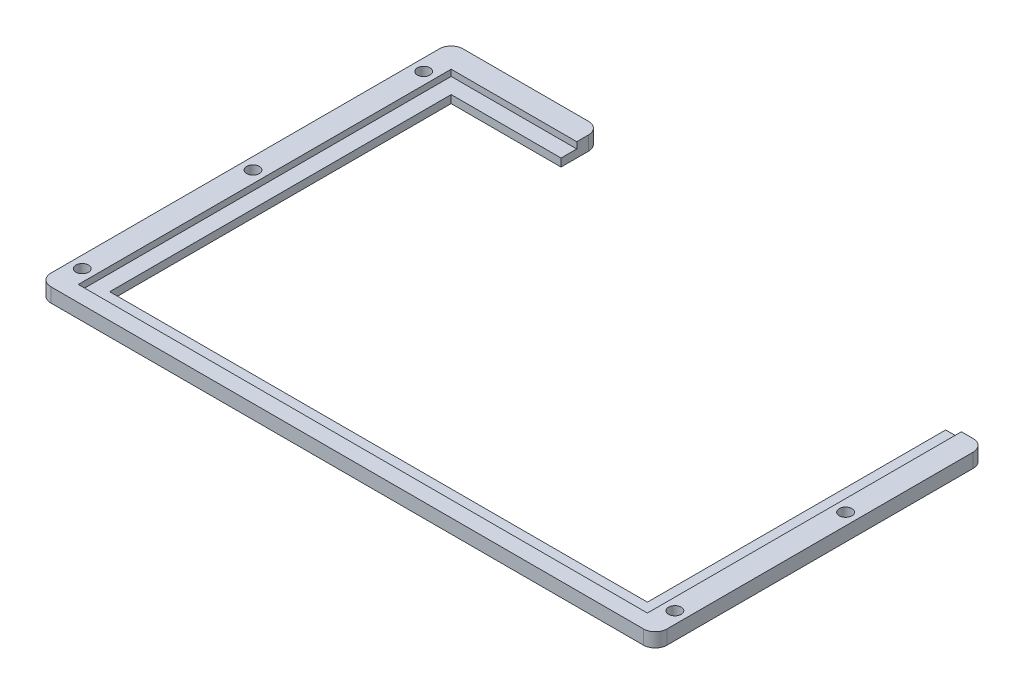
ISO-10303-21;
HEADER;
FILE_DESCRIPTION(('STEP AP214'),'2;1');
FILE_NAME('part.step','',(''),(''),'','','');
FILE_SCHEMA(('AUTOMOTIVE_DESIGN { 1 0 10303 214 1 1 1 1 }'));
ENDSEC;
DATA;
#1=APPLICATION_CONTEXT('core data for automotive mechanical design processes');
#2=APPLICATION_PROTOCOL_DEFINITION('international standard','automotive_design',2000,#1);
#3=PRODUCT_CONTEXT('',#1,'mechanical');
#4=PRODUCT('Part','Part','',(#3));
#5=PRODUCT_RELATED_PRODUCT_CATEGORY('part','',(#4));
#6=PRODUCT_DEFINITION_FORMATION('','',#4);
#7=PRODUCT_DEFINITION_CONTEXT('part definition',#1,'design');
#8=PRODUCT_DEFINITION('design','',#6,#7);
#9=PRODUCT_DEFINITION_SHAPE('','',#8);
#10=(LENGTH_UNIT() NAMED_UNIT(*) SI_UNIT(.MILLI.,.METRE.));
#11=(NAMED_UNIT(*) PLANE_ANGLE_UNIT() SI_UNIT($,.RADIAN.));
#12=(NAMED_UNIT(*) SI_UNIT($,.STERADIAN.) SOLID_ANGLE_UNIT());
#13=UNCERTAINTY_MEASURE_WITH_UNIT(LENGTH_MEASURE(1.E-05),#10,'distance_accuracy_value','');
#14=(GEOMETRIC_REPRESENTATION_CONTEXT(3) GLOBAL_UNCERTAINTY_ASSIGNED_CONTEXT((#13)) GLOBAL_UNIT_ASSIGNED_CONTEXT((#10,
#11,#12)) REPRESENTATION_CONTEXT('',''));
#15=CARTESIAN_POINT('',(0.,0.,0.));
#16=DIRECTION('',(0.,0.,1.));
#17=DIRECTION('',(1.,0.,0.));
#18=AXIS2_PLACEMENT_3D('',#15,#16,#17);
#19=CARTESIAN_POINT('',(119.85625,3.175,-46.83125));
#20=DIRECTION('',(0.,-1.,0.));
#21=DIRECTION('',(0.,0.,-1.));
#22=AXIS2_PLACEMENT_3D('',#19,#20,#21);
#23=PLANE('',#22);
#24=DIRECTION('',(0.,0.,1.));
#25=VECTOR('',#24,1.);
#26=CARTESIAN_POINT('',(115.09375,3.175,75.40625));
#27=LINE('',#26,#25);
#28=CARTESIAN_POINT('',(115.09375,3.175,-51.59375));
#29=VERTEX_POINT('',#28);
#30=CARTESIAN_POINT('',(115.09375,3.175,75.40625));
#31=VERTEX_POINT('',#30);
#32=EDGE_CURVE('E220',#29,#31,#27,.T.);
#33=ORIENTED_EDGE('',*,*,#32,.F.);
#34=DIRECTION('',(-1.,0.,0.));
#35=VECTOR('',#34,1.);
#36=CARTESIAN_POINT('',(108.74375,3.175,-51.59375));
#37=LINE('',#36,#35);
#38=CARTESIAN_POINT('',(108.74375,3.175,-51.59375));
#39=VERTEX_POINT('',#38);
#40=EDGE_CURVE('E214',#29,#39,#37,.T.);
#41=ORIENTED_EDGE('',*,*,#40,.T.);
#42=DIRECTION('',(0.,0.,1.));
#43=VECTOR('',#42,1.);
#44=CARTESIAN_POINT('',(108.74375,3.175,69.05625));
#45=LINE('',#44,#43);
#46=CARTESIAN_POINT('',(108.74375,3.175,69.05625));
#47=VERTEX_POINT('',#46);
#48=EDGE_CURVE('E217',#39,#47,#45,.T.);
#49=ORIENTED_EDGE('',*,*,#48,.T.);
#50=DIRECTION('',(-1.,0.,0.));
#51=VECTOR('',#50,1.);
#52=CARTESIAN_POINT('',(-108.74375,3.175,69.05625));
#53=LINE('',#52,#51);
#54=CARTESIAN_POINT('',(-108.74375,3.175,69.05625));
#55=VERTEX_POINT('',#54);
#56=EDGE_CURVE('E477',#47,#55,#53,.T.);
#57=ORIENTED_EDGE('',*,*,#56,.T.);
#58=DIRECTION('',(0.,0.,-1.));
#59=VECTOR('',#58,1.);
#60=CARTESIAN_POINT('',(-108.74375,3.175,-69.05625));
#61=LINE('',#60,#59);
#62=CARTESIAN_POINT('',(-108.74375,3.175,-69.05625));
#63=VERTEX_POINT('',#62);
#64=EDGE_CURVE('E434',#55,#63,#61,.T.);
#65=ORIENTED_EDGE('',*,*,#64,.T.);
#66=DIRECTION('',(1.,0.,0.));
#67=VECTOR('',#66,1.);
#68=CARTESIAN_POINT('',(-64.29375,3.175,-69.05625));
#69=LINE('',#68,#67);
#70=CARTESIAN_POINT('',(-64.29375,3.175,-69.05625));
#71=VERTEX_POINT('',#70);
#72=EDGE_CURVE('E203',#63,#71,#69,.T.);
#73=ORIENTED_EDGE('',*,*,#72,.T.);
#74=DIRECTION('',(0.,0.,-1.));
#75=VECTOR('',#74,1.);
#76=CARTESIAN_POINT('',(-64.29375,3.175,-80.16875));
#77=LINE('',#76,#75);
#78=CARTESIAN_POINT('',(-64.29375,3.175,-75.40625));
#79=VERTEX_POINT('',#78);
#80=EDGE_CURVE('E206',#71,#79,#77,.T.);
#81=ORIENTED_EDGE('',*,*,#80,.T.);
#82=DIRECTION('',(1.,0.,0.));
#83=VECTOR('',#82,1.);
#84=CARTESIAN_POINT('',(-64.29375,3.175,-75.40625));
#85=LINE('',#84,#83);
#86=CARTESIAN_POINT('',(-115.09375,3.175,-75.40625));
#87=VERTEX_POINT('',#86);
#88=EDGE_CURVE('E218',#87,#79,#85,.T.);
#89=ORIENTED_EDGE('',*,*,#88,.F.);
#90=DIRECTION('',(0.,0.,-1.));
#91=VECTOR('',#90,1.);
#92=CARTESIAN_POINT('',(-115.09375,3.175,-75.40625));
#93=LINE('',#92,#91);
#94=CARTESIAN_POINT('',(-115.09375,3.175,75.40625));
#95=VERTEX_POINT('',#94);
#96=EDGE_CURVE('E54',#95,#87,#93,.T.);
#97=ORIENTED_EDGE('',*,*,#96,.F.);
#98=DIRECTION('',(-1.,0.,0.));
#99=VECTOR('',#98,1.);
#100=CARTESIAN_POINT('',(-115.09375,3.175,75.40625));
#101=LINE('',#100,#99);
#102=EDGE_CURVE('E49',#31,#95,#101,.T.);
#103=ORIENTED_EDGE('',*,*,#102,.F.);
#104=EDGE_LOOP('',(#33,#41,#49,#57,#65,#73,#81,#89,#97,#103));
#105=FACE_BOUND('',#104,.T.);
#106=ADVANCED_FACE('F32',(#105),#23,.F.);
#107=CARTESIAN_POINT('',(-64.29375,3.175,-69.05625));
#108=DIRECTION('',(0.,0.,-1.));
#109=DIRECTION('',(-1.,0.,0.));
#110=AXIS2_PLACEMENT_3D('',#107,#108,#109);
#111=PLANE('',#110);
#112=DIRECTION('',(1.,0.,0.));
#113=VECTOR('',#112,1.);
#114=CARTESIAN_POINT('',(-64.29375,0.,-69.05625));
#115=LINE('',#114,#113);
#116=CARTESIAN_POINT('',(-108.74375,0.,-69.05625));
#117=VERTEX_POINT('',#116);
#118=CARTESIAN_POINT('',(-64.29375,0.,-69.05625));
#119=VERTEX_POINT('',#118);
#120=EDGE_CURVE('E192',#117,#119,#115,.T.);
#121=ORIENTED_EDGE('',*,*,#120,.T.);
#122=DIRECTION('',(0.,-1.,0.));
#123=VECTOR('',#122,1.);
#124=CARTESIAN_POINT('',(-64.29375,3.175,-69.05625));
#125=LINE('',#124,#123);
#126=EDGE_CURVE('E11',#71,#119,#125,.T.);
#127=ORIENTED_EDGE('',*,*,#126,.F.);
#128=ORIENTED_EDGE('',*,*,#72,.F.);
#129=DIRECTION('',(0.,-1.,0.));
#130=VECTOR('',#129,1.);
#131=CARTESIAN_POINT('',(-108.74375,3.175,-69.05625));
#132=LINE('',#131,#130);
#133=EDGE_CURVE('E430',#63,#117,#132,.T.);
#134=ORIENTED_EDGE('',*,*,#133,.T.);
#135=EDGE_LOOP('',(#121,#127,#128,#134));
#136=FACE_BOUND('',#135,.T.);
#137=ADVANCED_FACE('F34',(#136),#111,.F.);
#138=CARTESIAN_POINT('',(-64.29375,3.175,-80.16875));
#139=DIRECTION('',(-1.,0.,0.));
#140=DIRECTION('',(0.,0.,1.));
#141=AXIS2_PLACEMENT_3D('',#138,#139,#140);
#142=PLANE('',#141);
#143=DIRECTION('',(0.,0.,-1.));
#144=VECTOR('',#143,1.);
#145=CARTESIAN_POINT('',(-64.29375,0.,-80.16875));
#146=LINE('',#145,#144);
#147=CARTESIAN_POINT('',(-64.29375,0.,-80.16875));
#148=VERTEX_POINT('',#147);
#149=EDGE_CURVE('E195',#119,#148,#146,.T.);
#150=ORIENTED_EDGE('',*,*,#149,.T.);
#151=DIRECTION('',(0.,-1.,0.));
#152=VECTOR('',#151,1.);
#153=CARTESIAN_POINT('',(-64.29375,3.175,-80.16875));
#154=LINE('',#153,#152);
#155=CARTESIAN_POINT('',(-64.29375,5.715,-80.16875));
#156=VERTEX_POINT('',#155);
#157=EDGE_CURVE('E41',#156,#148,#154,.T.);
#158=ORIENTED_EDGE('',*,*,#157,.F.);
#159=DIRECTION('',(0.,0.,-1.));
#160=VECTOR('',#159,1.);
#161=CARTESIAN_POINT('',(-64.29375,5.715,-80.16875));
#162=LINE('',#161,#160);
#163=CARTESIAN_POINT('',(-64.29375,5.715,-75.40625));
#164=VERTEX_POINT('',#163);
#165=EDGE_CURVE('E180',#164,#156,#162,.T.);
#166=ORIENTED_EDGE('',*,*,#165,.F.);
#167=DIRECTION('',(0.,-1.,0.));
#168=VECTOR('',#167,1.);
#169=CARTESIAN_POINT('',(-64.29375,5.715,-75.40625));
#170=LINE('',#169,#168);
#171=EDGE_CURVE('E176',#164,#79,#170,.T.);
#172=ORIENTED_EDGE('',*,*,#171,.T.);
#173=ORIENTED_EDGE('',*,*,#80,.F.);
#174=ORIENTED_EDGE('',*,*,#126,.T.);
#175=EDGE_LOOP('',(#150,#158,#166,#172,#173,#174));
#176=FACE_BOUND('',#175,.T.);
#177=ADVANCED_FACE('F331',(#176),#142,.F.);
#178=CARTESIAN_POINT('',(-69.05625,3.175,-80.16875));
#179=DIRECTION('',(0.,-1.,0.));
#180=DIRECTION('',(0.,0.,-1.));
#181=AXIS2_PLACEMENT_3D('',#178,#179,#180);
#182=CYLINDRICAL_SURFACE('',#181,4.7625);
#183=CARTESIAN_POINT('',(-69.05625,0.,-80.16875));
#184=DIRECTION('',(0.,1.,0.));
#185=DIRECTION('',(0.,0.,1.));
#186=AXIS2_PLACEMENT_3D('',#183,#184,#185);
#187=CIRCLE('',#186,4.7625);
#188=CARTESIAN_POINT('',(-69.05625,0.,-84.93125));
#189=VERTEX_POINT('',#188);
#190=EDGE_CURVE('E398',#148,#189,#187,.T.);
#191=ORIENTED_EDGE('',*,*,#190,.T.);
#192=DIRECTION('',(0.,-1.,0.));
#193=VECTOR('',#192,1.);
#194=CARTESIAN_POINT('',(-69.05625,3.175,-84.93125));
#195=LINE('',#194,#193);
#196=CARTESIAN_POINT('',(-69.05625,5.715,-84.93125));
#197=VERTEX_POINT('',#196);
#198=EDGE_CURVE('E402',#197,#189,#195,.T.);
#199=ORIENTED_EDGE('',*,*,#198,.F.);
#200=CARTESIAN_POINT('',(-69.05625,5.715,-80.16875));
#201=DIRECTION('',(0.,1.,0.));
#202=DIRECTION('',(0.,0.,1.));
#203=AXIS2_PLACEMENT_3D('',#200,#201,#202);
#204=CIRCLE('',#203,4.7625);
#205=EDGE_CURVE('E257',#156,#197,#204,.T.);
#206=ORIENTED_EDGE('',*,*,#205,.F.);
#207=ORIENTED_EDGE('',*,*,#157,.T.);
#208=EDGE_LOOP('',(#191,#199,#206,#207));
#209=FACE_BOUND('',#208,.T.);
#210=ADVANCED_FACE('F385',(#209),#182,.T.);
#211=CARTESIAN_POINT('',(-119.85625,3.175,-84.93125));
#212=DIRECTION('',(0.,0.,1.));
#213=DIRECTION('',(1.,0.,0.));
#214=AXIS2_PLACEMENT_3D('',#211,#212,#213);
#215=PLANE('',#214);
#216=DIRECTION('',(-1.,0.,0.));
#217=VECTOR('',#216,1.);
#218=CARTESIAN_POINT('',(-119.85625,0.,-84.93125));
#219=LINE('',#218,#217);
#220=CARTESIAN_POINT('',(-119.85625,0.,-84.93125));
#221=VERTEX_POINT('',#220);
#222=EDGE_CURVE('E405',#189,#221,#219,.T.);
#223=ORIENTED_EDGE('',*,*,#222,.T.);
#224=DIRECTION('',(0.,-1.,0.));
#225=VECTOR('',#224,1.);
#226=CARTESIAN_POINT('',(-119.85625,3.175,-84.93125));
#227=LINE('',#226,#225);
#228=CARTESIAN_POINT('',(-119.85625,5.715,-84.93125));
#229=VERTEX_POINT('',#228);
#230=EDGE_CURVE('E464',#229,#221,#227,.T.);
#231=ORIENTED_EDGE('',*,*,#230,.F.);
#232=DIRECTION('',(-1.,0.,0.));
#233=VECTOR('',#232,1.);
#234=CARTESIAN_POINT('',(-119.85625,5.715,-84.93125));
#235=LINE('',#234,#233);
#236=EDGE_CURVE('E254',#197,#229,#235,.T.);
#237=ORIENTED_EDGE('',*,*,#236,.F.);
#238=ORIENTED_EDGE('',*,*,#198,.T.);
#239=EDGE_LOOP('',(#223,#231,#237,#238));
#240=FACE_BOUND('',#239,.T.);
#241=ADVANCED_FACE('F381',(#240),#215,.F.);
#242=CARTESIAN_POINT('',(-119.85625,3.175,-80.16875));
#243=DIRECTION('',(0.,-1.,0.));
#244=DIRECTION('',(0.,0.,-1.));
#245=AXIS2_PLACEMENT_3D('',#242,#243,#244);
#246=CYLINDRICAL_SURFACE('',#245,4.76250000000001);
#247=CARTESIAN_POINT('',(-119.85625,0.,-80.16875));
#248=DIRECTION('',(0.,1.,0.));
#249=DIRECTION('',(0.,0.,-1.));
#250=AXIS2_PLACEMENT_3D('',#247,#248,#249);
#251=CIRCLE('',#250,4.76250000000001);
#252=CARTESIAN_POINT('',(-124.61875,0.,-80.16875));
#253=VERTEX_POINT('',#252);
#254=EDGE_CURVE('E407',#221,#253,#251,.T.);
#255=ORIENTED_EDGE('',*,*,#254,.T.);
#256=DIRECTION('',(0.,-1.,0.));
#257=VECTOR('',#256,1.);
#258=CARTESIAN_POINT('',(-124.61875,3.175,-80.16875));
#259=LINE('',#258,#257);
#260=CARTESIAN_POINT('',(-124.61875,5.715,-80.16875));
#261=VERTEX_POINT('',#260);
#262=EDGE_CURVE('E461',#261,#253,#259,.T.);
#263=ORIENTED_EDGE('',*,*,#262,.F.);
#264=CARTESIAN_POINT('',(-119.85625,5.715,-80.16875));
#265=DIRECTION('',(0.,1.,0.));
#266=DIRECTION('',(0.,0.,-1.));
#267=AXIS2_PLACEMENT_3D('',#264,#265,#266);
#268=CIRCLE('',#267,4.76249999999999);
#269=EDGE_CURVE('E251',#229,#261,#268,.T.);
#270=ORIENTED_EDGE('',*,*,#269,.F.);
#271=ORIENTED_EDGE('',*,*,#230,.T.);
#272=EDGE_LOOP('',(#255,#263,#270,#271));
#273=FACE_BOUND('',#272,.T.);
#274=ADVANCED_FACE('F377',(#273),#246,.T.);
#275=CARTESIAN_POINT('',(-124.61875,3.175,76.99375));
#276=DIRECTION('',(1.,0.,0.));
#277=DIRECTION('',(0.,0.,-1.));
#278=AXIS2_PLACEMENT_3D('',#275,#276,#277);
#279=PLANE('',#278);
#280=DIRECTION('',(0.,0.,1.));
#281=VECTOR('',#280,1.);
#282=CARTESIAN_POINT('',(-124.61875,0.,76.99375));
#283=LINE('',#282,#281);
#284=CARTESIAN_POINT('',(-124.61875,0.,76.99375));
#285=VERTEX_POINT('',#284);
#286=EDGE_CURVE('E411',#253,#285,#283,.T.);
#287=ORIENTED_EDGE('',*,*,#286,.T.);
#288=DIRECTION('',(0.,-1.,0.));
#289=VECTOR('',#288,1.);
#290=CARTESIAN_POINT('',(-124.61875,3.175,76.99375));
#291=LINE('',#290,#289);
#292=CARTESIAN_POINT('',(-124.61875,5.715,76.99375));
#293=VERTEX_POINT('',#292);
#294=EDGE_CURVE('E458',#293,#285,#291,.T.);
#295=ORIENTED_EDGE('',*,*,#294,.F.);
#296=DIRECTION('',(0.,0.,1.));
#297=VECTOR('',#296,1.);
#298=CARTESIAN_POINT('',(-124.61875,5.715,76.99375));
#299=LINE('',#298,#297);
#300=EDGE_CURVE('E248',#261,#293,#299,.T.);
#301=ORIENTED_EDGE('',*,*,#300,.F.);
#302=ORIENTED_EDGE('',*,*,#262,.T.);
#303=EDGE_LOOP('',(#287,#295,#301,#302));
#304=FACE_BOUND('',#303,.T.);
#305=ADVANCED_FACE('F373',(#304),#279,.F.);
#306=CARTESIAN_POINT('',(-119.85625,3.175,76.99375));
#307=DIRECTION('',(0.,-1.,0.));
#308=DIRECTION('',(0.,0.,-1.));
#309=AXIS2_PLACEMENT_3D('',#306,#307,#308);
#310=CYLINDRICAL_SURFACE('',#309,4.76250000000001);
#311=CARTESIAN_POINT('',(-119.85625,0.,76.99375));
#312=DIRECTION('',(0.,1.,0.));
#313=DIRECTION('',(0.,0.,-1.));
#314=AXIS2_PLACEMENT_3D('',#311,#312,#313);
#315=CIRCLE('',#314,4.76250000000001);
#316=CARTESIAN_POINT('',(-119.85625,0.,81.75625));
#317=VERTEX_POINT('',#316);
#318=EDGE_CURVE('E413',#285,#317,#315,.T.);
#319=ORIENTED_EDGE('',*,*,#318,.T.);
#320=DIRECTION('',(0.,-1.,0.));
#321=VECTOR('',#320,1.);
#322=CARTESIAN_POINT('',(-119.85625,3.175,81.75625));
#323=LINE('',#322,#321);
#324=CARTESIAN_POINT('',(-119.85625,5.715,81.75625));
#325=VERTEX_POINT('',#324);
#326=EDGE_CURVE('E455',#325,#317,#323,.T.);
#327=ORIENTED_EDGE('',*,*,#326,.F.);
#328=CARTESIAN_POINT('',(-119.85625,5.715,76.99375));
#329=DIRECTION('',(0.,1.,0.));
#330=DIRECTION('',(0.,0.,-1.));
#331=AXIS2_PLACEMENT_3D('',#328,#329,#330);
#332=CIRCLE('',#331,4.76250000000001);
#333=EDGE_CURVE('E245',#293,#325,#332,.T.);
#334=ORIENTED_EDGE('',*,*,#333,.F.);
#335=ORIENTED_EDGE('',*,*,#294,.T.);
#336=EDGE_LOOP('',(#319,#327,#334,#335));
#337=FACE_BOUND('',#336,.T.);
#338=ADVANCED_FACE('F369',(#337),#310,.T.);
#339=CARTESIAN_POINT('',(119.85625,3.175,81.75625));
#340=DIRECTION('',(0.,0.,-1.));
#341=DIRECTION('',(-1.,0.,0.));
#342=AXIS2_PLACEMENT_3D('',#339,#340,#341);
#343=PLANE('',#342);
#344=DIRECTION('',(1.,0.,0.));
#345=VECTOR('',#344,1.);
#346=CARTESIAN_POINT('',(119.85625,0.,81.75625));
#347=LINE('',#346,#345);
#348=CARTESIAN_POINT('',(119.85625,0.,81.75625));
#349=VERTEX_POINT('',#348);
#350=EDGE_CURVE('E415',#317,#349,#347,.T.);
#351=ORIENTED_EDGE('',*,*,#350,.T.);
#352=DIRECTION('',(0.,-1.,0.));
#353=VECTOR('',#352,1.);
#354=CARTESIAN_POINT('',(119.85625,3.175,81.75625));
#355=LINE('',#354,#353);
#356=CARTESIAN_POINT('',(119.85625,5.715,81.75625));
#357=VERTEX_POINT('',#356);
#358=EDGE_CURVE('E452',#357,#349,#355,.T.);
#359=ORIENTED_EDGE('',*,*,#358,.F.);
#360=DIRECTION('',(1.,0.,0.));
#361=VECTOR('',#360,1.);
#362=CARTESIAN_POINT('',(119.85625,5.715,81.75625));
#363=LINE('',#362,#361);
#364=EDGE_CURVE('E242',#325,#357,#363,.T.);
#365=ORIENTED_EDGE('',*,*,#364,.F.);
#366=ORIENTED_EDGE('',*,*,#326,.T.);
#367=EDGE_LOOP('',(#351,#359,#365,#366));
#368=FACE_BOUND('',#367,.T.);
#369=ADVANCED_FACE('F365',(#368),#343,.F.);
#370=CARTESIAN_POINT('',(119.85625,3.175,76.99375));
#371=DIRECTION('',(0.,-1.,0.));
#372=DIRECTION('',(0.,0.,-1.));
#373=AXIS2_PLACEMENT_3D('',#370,#371,#372);
#374=CYLINDRICAL_SURFACE('',#373,4.7625);
#375=CARTESIAN_POINT('',(119.85625,0.,76.99375));
#376=DIRECTION('',(0.,1.,0.));
#377=DIRECTION('',(0.,0.,-1.));
#378=AXIS2_PLACEMENT_3D('',#375,#376,#377);
#379=CIRCLE('',#378,4.7625);
#380=CARTESIAN_POINT('',(124.61875,0.,76.99375));
#381=VERTEX_POINT('',#380);
#382=EDGE_CURVE('E417',#349,#381,#379,.T.);
#383=ORIENTED_EDGE('',*,*,#382,.T.);
#384=DIRECTION('',(0.,-1.,0.));
#385=VECTOR('',#384,1.);
#386=CARTESIAN_POINT('',(124.61875,3.175,76.99375));
#387=LINE('',#386,#385);
#388=CARTESIAN_POINT('',(124.61875,5.715,76.9937499999999));
#389=VERTEX_POINT('',#388);
#390=EDGE_CURVE('E449',#389,#381,#387,.T.);
#391=ORIENTED_EDGE('',*,*,#390,.F.);
#392=CARTESIAN_POINT('',(119.85625,5.715,76.9937499999999));
#393=DIRECTION('',(0.,1.,0.));
#394=DIRECTION('',(0.,0.,-1.));
#395=AXIS2_PLACEMENT_3D('',#392,#393,#394);
#396=CIRCLE('',#395,4.7625);
#397=EDGE_CURVE('E239',#357,#389,#396,.T.);
#398=ORIENTED_EDGE('',*,*,#397,.F.);
#399=ORIENTED_EDGE('',*,*,#358,.T.);
#400=EDGE_LOOP('',(#383,#391,#398,#399));
#401=FACE_BOUND('',#400,.T.);
#402=ADVANCED_FACE('F361',(#401),#374,.T.);
#403=CARTESIAN_POINT('',(124.61875,3.175,-46.83125));
#404=DIRECTION('',(-1.,0.,0.));
#405=DIRECTION('',(0.,0.,1.));
#406=AXIS2_PLACEMENT_3D('',#403,#404,#405);
#407=PLANE('',#406);
#408=DIRECTION('',(0.,0.,-1.));
#409=VECTOR('',#408,1.);
#410=CARTESIAN_POINT('',(124.61875,0.,-46.83125));
#411=LINE('',#410,#409);
#412=CARTESIAN_POINT('',(124.61875,0.,-46.83125));
#413=VERTEX_POINT('',#412);
#414=EDGE_CURVE('E419',#381,#413,#411,.T.);
#415=ORIENTED_EDGE('',*,*,#414,.T.);
#416=DIRECTION('',(0.,-1.,0.));
#417=VECTOR('',#416,1.);
#418=CARTESIAN_POINT('',(124.61875,3.175,-46.83125));
#419=LINE('',#418,#417);
#420=CARTESIAN_POINT('',(124.61875,5.715,-46.83125));
#421=VERTEX_POINT('',#420);
#422=EDGE_CURVE('E446',#421,#413,#419,.T.);
#423=ORIENTED_EDGE('',*,*,#422,.F.);
#424=DIRECTION('',(0.,0.,-1.));
#425=VECTOR('',#424,1.);
#426=CARTESIAN_POINT('',(124.61875,5.715,-46.83125));
#427=LINE('',#426,#425);
#428=EDGE_CURVE('E236',#389,#421,#427,.T.);
#429=ORIENTED_EDGE('',*,*,#428,.F.);
#430=ORIENTED_EDGE('',*,*,#390,.T.);
#431=EDGE_LOOP('',(#415,#423,#429,#430));
#432=FACE_BOUND('',#431,.T.);
#433=ADVANCED_FACE('F357',(#432),#407,.F.);
#434=CARTESIAN_POINT('',(119.85625,3.175,-46.83125));
#435=DIRECTION('',(0.,-1.,0.));
#436=DIRECTION('',(0.,0.,-1.));
#437=AXIS2_PLACEMENT_3D('',#434,#435,#436);
#438=CYLINDRICAL_SURFACE('',#437,4.7625);
#439=CARTESIAN_POINT('',(119.85625,0.,-46.83125));
#440=DIRECTION('',(0.,1.,0.));
#441=DIRECTION('',(0.,0.,-1.));
#442=AXIS2_PLACEMENT_3D('',#439,#440,#441);
#443=CIRCLE('',#442,4.7625);
#444=CARTESIAN_POINT('',(119.85625,0.,-51.59375));
#445=VERTEX_POINT('',#444);
#446=EDGE_CURVE('E421',#413,#445,#443,.T.);
#447=ORIENTED_EDGE('',*,*,#446,.T.);
#448=DIRECTION('',(0.,-1.,0.));
#449=VECTOR('',#448,1.);
#450=CARTESIAN_POINT('',(119.85625,3.175,-51.59375));
#451=LINE('',#450,#449);
#452=CARTESIAN_POINT('',(119.85625,5.715,-51.59375));
#453=VERTEX_POINT('',#452);
#454=EDGE_CURVE('E443',#453,#445,#451,.T.);
#455=ORIENTED_EDGE('',*,*,#454,.F.);
#456=CARTESIAN_POINT('',(119.85625,5.715,-46.83125));
#457=DIRECTION('',(0.,1.,0.));
#458=DIRECTION('',(0.,0.,-1.));
#459=AXIS2_PLACEMENT_3D('',#456,#457,#458);
#460=CIRCLE('',#459,4.7625);
#461=EDGE_CURVE('E233',#421,#453,#460,.T.);
#462=ORIENTED_EDGE('',*,*,#461,.F.);
#463=ORIENTED_EDGE('',*,*,#422,.T.);
#464=EDGE_LOOP('',(#447,#455,#462,#463));
#465=FACE_BOUND('',#464,.T.);
#466=ADVANCED_FACE('F353',(#465),#438,.T.);
#467=CARTESIAN_POINT('',(108.74375,3.175,-51.59375));
#468=DIRECTION('',(0.,0.,1.));
#469=DIRECTION('',(1.,0.,0.));
#470=AXIS2_PLACEMENT_3D('',#467,#468,#469);
#471=PLANE('',#470);
#472=DIRECTION('',(-1.,0.,0.));
#473=VECTOR('',#472,1.);
#474=CARTESIAN_POINT('',(108.74375,0.,-51.59375));
#475=LINE('',#474,#473);
#476=CARTESIAN_POINT('',(108.74375,0.,-51.59375));
#477=VERTEX_POINT('',#476);
#478=EDGE_CURVE('E423',#445,#477,#475,.T.);
#479=ORIENTED_EDGE('',*,*,#478,.T.);
#480=DIRECTION('',(0.,-1.,0.));
#481=VECTOR('',#480,1.);
#482=CARTESIAN_POINT('',(108.74375,3.175,-51.59375));
#483=LINE('',#482,#481);
#484=EDGE_CURVE('E440',#39,#477,#483,.T.);
#485=ORIENTED_EDGE('',*,*,#484,.F.);
#486=ORIENTED_EDGE('',*,*,#40,.F.);
#487=DIRECTION('',(0.,-1.,0.));
#488=VECTOR('',#487,1.);
#489=CARTESIAN_POINT('',(115.09375,5.715,-51.59375));
#490=LINE('',#489,#488);
#491=CARTESIAN_POINT('',(115.09375,5.715,-51.59375));
#492=VERTEX_POINT('',#491);
#493=EDGE_CURVE('E197',#492,#29,#490,.T.);
#494=ORIENTED_EDGE('',*,*,#493,.F.);
#495=DIRECTION('',(-1.,0.,0.));
#496=VECTOR('',#495,1.);
#497=CARTESIAN_POINT('',(115.09375,5.715,-51.59375));
#498=LINE('',#497,#496);
#499=EDGE_CURVE('E229',#453,#492,#498,.T.);
#500=ORIENTED_EDGE('',*,*,#499,.F.);
#501=ORIENTED_EDGE('',*,*,#454,.T.);
#502=EDGE_LOOP('',(#479,#485,#486,#494,#500,#501));
#503=FACE_BOUND('',#502,.T.);
#504=ADVANCED_FACE('F349',(#503),#471,.F.);
#505=CARTESIAN_POINT('',(108.74375,3.175,69.05625));
#506=DIRECTION('',(1.,0.,0.));
#507=DIRECTION('',(0.,0.,-1.));
#508=AXIS2_PLACEMENT_3D('',#505,#506,#507);
#509=PLANE('',#508);
#510=DIRECTION('',(0.,0.,1.));
#511=VECTOR('',#510,1.);
#512=CARTESIAN_POINT('',(108.74375,0.,69.05625));
#513=LINE('',#512,#511);
#514=CARTESIAN_POINT('',(108.74375,0.,69.05625));
#515=VERTEX_POINT('',#514);
#516=EDGE_CURVE('E425',#477,#515,#513,.T.);
#517=ORIENTED_EDGE('',*,*,#516,.T.);
#518=DIRECTION('',(0.,-1.,0.));
#519=VECTOR('',#518,1.);
#520=CARTESIAN_POINT('',(108.74375,3.175,69.05625));
#521=LINE('',#520,#519);
#522=EDGE_CURVE('E437',#47,#515,#521,.T.);
#523=ORIENTED_EDGE('',*,*,#522,.F.);
#524=ORIENTED_EDGE('',*,*,#48,.F.);
#525=ORIENTED_EDGE('',*,*,#484,.T.);
#526=EDGE_LOOP('',(#517,#523,#524,#525));
#527=FACE_BOUND('',#526,.T.);
#528=ADVANCED_FACE('F345',(#527),#509,.F.);
#529=CARTESIAN_POINT('',(-108.74375,3.175,69.05625));
#530=DIRECTION('',(0.,0.,1.));
#531=DIRECTION('',(1.,0.,0.));
#532=AXIS2_PLACEMENT_3D('',#529,#530,#531);
#533=PLANE('',#532);
#534=DIRECTION('',(-1.,0.,0.));
#535=VECTOR('',#534,1.);
#536=CARTESIAN_POINT('',(-108.74375,0.,69.05625));
#537=LINE('',#536,#535);
#538=CARTESIAN_POINT('',(-108.74375,0.,69.05625));
#539=VERTEX_POINT('',#538);
#540=EDGE_CURVE('E427',#515,#539,#537,.T.);
#541=ORIENTED_EDGE('',*,*,#540,.T.);
#542=DIRECTION('',(0.,-1.,0.));
#543=VECTOR('',#542,1.);
#544=CARTESIAN_POINT('',(-108.74375,3.175,69.05625));
#545=LINE('',#544,#543);
#546=EDGE_CURVE('E433',#55,#539,#545,.T.);
#547=ORIENTED_EDGE('',*,*,#546,.F.);
#548=ORIENTED_EDGE('',*,*,#56,.F.);
#549=ORIENTED_EDGE('',*,*,#522,.T.);
#550=EDGE_LOOP('',(#541,#547,#548,#549));
#551=FACE_BOUND('',#550,.T.);
#552=ADVANCED_FACE('F341',(#551),#533,.F.);
#553=CARTESIAN_POINT('',(-108.74375,3.175,-69.05625));
#554=DIRECTION('',(-1.,0.,0.));
#555=DIRECTION('',(0.,0.,1.));
#556=AXIS2_PLACEMENT_3D('',#553,#554,#555);
#557=PLANE('',#556);
#558=DIRECTION('',(0.,0.,-1.));
#559=VECTOR('',#558,1.);
#560=CARTESIAN_POINT('',(-108.74375,0.,-69.05625));
#561=LINE('',#560,#559);
#562=EDGE_CURVE('E207',#539,#117,#561,.T.);
#563=ORIENTED_EDGE('',*,*,#562,.T.);
#564=ORIENTED_EDGE('',*,*,#133,.F.);
#565=ORIENTED_EDGE('',*,*,#64,.F.);
#566=ORIENTED_EDGE('',*,*,#546,.T.);
#567=EDGE_LOOP('',(#563,#564,#565,#566));
#568=FACE_BOUND('',#567,.T.);
#569=ADVANCED_FACE('F338',(#568),#557,.F.);
#570=CARTESIAN_POINT('',(119.85625,0.,-46.83125));
#571=DIRECTION('',(0.,-1.,0.));
#572=DIRECTION('',(0.,0.,-1.));
#573=AXIS2_PLACEMENT_3D('',#570,#571,#572);
#574=PLANE('',#573);
#575=CARTESIAN_POINT('',(119.85625,0.,0.));
#576=DIRECTION('',(0.,1.,0.));
#577=DIRECTION('',(0.,0.,1.));
#578=AXIS2_PLACEMENT_3D('',#575,#576,#577);
#579=CIRCLE('',#578,2.55270000000001);
#580=CARTESIAN_POINT('',(119.85625,0.,2.5527));
#581=VERTEX_POINT('',#580);
#582=EDGE_CURVE('E283',#581,#581,#579,.T.);
#583=ORIENTED_EDGE('',*,*,#582,.T.);
#584=EDGE_LOOP('',(#583));
#585=FACE_BOUND('',#584,.T.);
#586=CARTESIAN_POINT('',(119.85625,0.,69.05625));
#587=DIRECTION('',(0.,1.,0.));
#588=DIRECTION('',(0.,0.,1.));
#589=AXIS2_PLACEMENT_3D('',#586,#587,#588);
#590=CIRCLE('',#589,2.55270000000001);
#591=CARTESIAN_POINT('',(119.85625,0.,71.60895));
#592=VERTEX_POINT('',#591);
#593=EDGE_CURVE('E277',#592,#592,#590,.T.);
#594=ORIENTED_EDGE('',*,*,#593,.T.);
#595=EDGE_LOOP('',(#594));
#596=FACE_BOUND('',#595,.T.);
#597=CARTESIAN_POINT('',(-119.85625,0.,0.));
#598=DIRECTION('',(0.,1.,0.));
#599=DIRECTION('',(0.,0.,1.));
#600=AXIS2_PLACEMENT_3D('',#597,#598,#599);
#601=CIRCLE('',#600,2.55270000000001);
#602=CARTESIAN_POINT('',(-119.85625,0.,2.5527));
#603=VERTEX_POINT('',#602);
#604=EDGE_CURVE('E271',#603,#603,#601,.T.);
#605=ORIENTED_EDGE('',*,*,#604,.T.);
#606=EDGE_LOOP('',(#605));
#607=FACE_BOUND('',#606,.T.);
#608=CARTESIAN_POINT('',(-119.85625,0.,69.05625));
#609=DIRECTION('',(0.,1.,0.));
#610=DIRECTION('',(0.,0.,1.));
#611=AXIS2_PLACEMENT_3D('',#608,#609,#610);
#612=CIRCLE('',#611,2.55270000000001);
#613=CARTESIAN_POINT('',(-119.85625,0.,71.60895));
#614=VERTEX_POINT('',#613);
#615=EDGE_CURVE('E265',#614,#614,#612,.T.);
#616=ORIENTED_EDGE('',*,*,#615,.T.);
#617=EDGE_LOOP('',(#616));
#618=FACE_BOUND('',#617,.T.);
#619=CARTESIAN_POINT('',(-119.85625,0.,-69.05625));
#620=DIRECTION('',(0.,1.,0.));
#621=DIRECTION('',(0.,0.,1.));
#622=AXIS2_PLACEMENT_3D('',#619,#620,#621);
#623=CIRCLE('',#622,2.55270000000001);
#624=CARTESIAN_POINT('',(-119.85625,0.,-66.50355));
#625=VERTEX_POINT('',#624);
#626=EDGE_CURVE('E264',#625,#625,#623,.T.);
#627=ORIENTED_EDGE('',*,*,#626,.T.);
#628=EDGE_LOOP('',(#627));
#629=FACE_BOUND('',#628,.T.);
#630=ORIENTED_EDGE('',*,*,#120,.F.);
#631=ORIENTED_EDGE('',*,*,#562,.F.);
#632=ORIENTED_EDGE('',*,*,#540,.F.);
#633=ORIENTED_EDGE('',*,*,#516,.F.);
#634=ORIENTED_EDGE('',*,*,#478,.F.);
#635=ORIENTED_EDGE('',*,*,#446,.F.);
#636=ORIENTED_EDGE('',*,*,#414,.F.);
#637=ORIENTED_EDGE('',*,*,#382,.F.);
#638=ORIENTED_EDGE('',*,*,#350,.F.);
#639=ORIENTED_EDGE('',*,*,#318,.F.);
#640=ORIENTED_EDGE('',*,*,#286,.F.);
#641=ORIENTED_EDGE('',*,*,#254,.F.);
#642=ORIENTED_EDGE('',*,*,#222,.F.);
#643=ORIENTED_EDGE('',*,*,#190,.F.);
#644=ORIENTED_EDGE('',*,*,#149,.F.);
#645=EDGE_LOOP('',(#630,#631,#632,#633,#634,#635,#636,#637,#638,#639,#640,#641,#642,#643,#644));
#646=FACE_BOUND('',#645,.T.);
#647=ADVANCED_FACE('F292',(#585,#596,#607,#618,#629,#646),#574,.T.);
#648=CARTESIAN_POINT('',(-115.09375,5.715,-75.40625));
#649=DIRECTION('',(-1.,0.,0.));
#650=DIRECTION('',(0.,0.,1.));
#651=AXIS2_PLACEMENT_3D('',#648,#649,#650);
#652=PLANE('',#651);
#653=ORIENTED_EDGE('',*,*,#96,.T.);
#654=DIRECTION('',(0.,-1.,0.));
#655=VECTOR('',#654,1.);
#656=CARTESIAN_POINT('',(-115.09375,5.715,-75.40625));
#657=LINE('',#656,#655);
#658=CARTESIAN_POINT('',(-115.09375,5.715,-75.40625));
#659=VERTEX_POINT('',#658);
#660=EDGE_CURVE('E174',#659,#87,#657,.T.);
#661=ORIENTED_EDGE('',*,*,#660,.F.);
#662=DIRECTION('',(0.,0.,-1.));
#663=VECTOR('',#662,1.);
#664=CARTESIAN_POINT('',(-115.09375,5.715,-75.40625));
#665=LINE('',#664,#663);
#666=CARTESIAN_POINT('',(-115.09375,5.715,75.40625));
#667=VERTEX_POINT('',#666);
#668=EDGE_CURVE('E181',#667,#659,#665,.T.);
#669=ORIENTED_EDGE('',*,*,#668,.F.);
#670=DIRECTION('',(0.,-1.,0.));
#671=VECTOR('',#670,1.);
#672=CARTESIAN_POINT('',(-115.09375,5.715,75.40625));
#673=LINE('',#672,#671);
#674=EDGE_CURVE('E226',#667,#95,#673,.T.);
#675=ORIENTED_EDGE('',*,*,#674,.T.);
#676=EDGE_LOOP('',(#653,#661,#669,#675));
#677=FACE_BOUND('',#676,.T.);
#678=ADVANCED_FACE('F191',(#677),#652,.F.);
#679=CARTESIAN_POINT('',(-64.29375,5.715,-75.40625));
#680=DIRECTION('',(0.,0.,-1.));
#681=DIRECTION('',(-1.,0.,0.));
#682=AXIS2_PLACEMENT_3D('',#679,#680,#681);
#683=PLANE('',#682);
#684=ORIENTED_EDGE('',*,*,#88,.T.);
#685=ORIENTED_EDGE('',*,*,#171,.F.);
#686=DIRECTION('',(1.,0.,0.));
#687=VECTOR('',#686,1.);
#688=CARTESIAN_POINT('',(-64.29375,5.715,-75.40625));
#689=LINE('',#688,#687);
#690=EDGE_CURVE('E169',#659,#164,#689,.T.);
#691=ORIENTED_EDGE('',*,*,#690,.F.);
#692=ORIENTED_EDGE('',*,*,#660,.T.);
#693=EDGE_LOOP('',(#684,#685,#691,#692));
#694=FACE_BOUND('',#693,.T.);
#695=ADVANCED_FACE('F172',(#694),#683,.F.);
#696=CARTESIAN_POINT('',(115.09375,5.715,75.40625));
#697=DIRECTION('',(1.,0.,0.));
#698=DIRECTION('',(0.,0.,-1.));
#699=AXIS2_PLACEMENT_3D('',#696,#697,#698);
#700=PLANE('',#699);
#701=ORIENTED_EDGE('',*,*,#32,.T.);
#702=DIRECTION('',(0.,-1.,0.));
#703=VECTOR('',#702,1.);
#704=CARTESIAN_POINT('',(115.09375,5.715,75.40625));
#705=LINE('',#704,#703);
#706=CARTESIAN_POINT('',(115.09375,5.715,75.40625));
#707=VERTEX_POINT('',#706);
#708=EDGE_CURVE('E201',#707,#31,#705,.T.);
#709=ORIENTED_EDGE('',*,*,#708,.F.);
#710=DIRECTION('',(0.,0.,1.));
#711=VECTOR('',#710,1.);
#712=CARTESIAN_POINT('',(115.09375,5.715,75.40625));
#713=LINE('',#712,#711);
#714=EDGE_CURVE('E228',#492,#707,#713,.T.);
#715=ORIENTED_EDGE('',*,*,#714,.F.);
#716=ORIENTED_EDGE('',*,*,#493,.T.);
#717=EDGE_LOOP('',(#701,#709,#715,#716));
#718=FACE_BOUND('',#717,.T.);
#719=ADVANCED_FACE('F501',(#718),#700,.F.);
#720=CARTESIAN_POINT('',(-115.09375,5.715,75.40625));
#721=DIRECTION('',(0.,0.,1.));
#722=DIRECTION('',(1.,0.,0.));
#723=AXIS2_PLACEMENT_3D('',#720,#721,#722);
#724=PLANE('',#723);
#725=ORIENTED_EDGE('',*,*,#102,.T.);
#726=ORIENTED_EDGE('',*,*,#674,.F.);
#727=DIRECTION('',(-1.,0.,0.));
#728=VECTOR('',#727,1.);
#729=CARTESIAN_POINT('',(-115.09375,5.715,75.40625));
#730=LINE('',#729,#728);
#731=EDGE_CURVE('E186',#707,#667,#730,.T.);
#732=ORIENTED_EDGE('',*,*,#731,.F.);
#733=ORIENTED_EDGE('',*,*,#708,.T.);
#734=EDGE_LOOP('',(#725,#726,#732,#733));
#735=FACE_BOUND('',#734,.T.);
#736=ADVANCED_FACE('F305',(#735),#724,.F.);
#737=CARTESIAN_POINT('',(119.85625,5.715,-46.83125));
#738=DIRECTION('',(0.,-1.,0.));
#739=DIRECTION('',(0.,0.,-1.));
#740=AXIS2_PLACEMENT_3D('',#737,#738,#739);
#741=PLANE('',#740);
#742=CARTESIAN_POINT('',(119.85625,5.715,0.));
#743=DIRECTION('',(0.,1.,0.));
#744=DIRECTION('',(0.,0.,1.));
#745=AXIS2_PLACEMENT_3D('',#742,#743,#744);
#746=CIRCLE('',#745,2.55270000000001);
#747=CARTESIAN_POINT('',(119.85625,5.715,2.5527));
#748=VERTEX_POINT('',#747);
#749=EDGE_CURVE('E286',#748,#748,#746,.T.);
#750=ORIENTED_EDGE('',*,*,#749,.F.);
#751=EDGE_LOOP('',(#750));
#752=FACE_BOUND('',#751,.T.);
#753=CARTESIAN_POINT('',(119.85625,5.715,69.05625));
#754=DIRECTION('',(0.,1.,0.));
#755=DIRECTION('',(0.,0.,1.));
#756=AXIS2_PLACEMENT_3D('',#753,#754,#755);
#757=CIRCLE('',#756,2.55270000000001);
#758=CARTESIAN_POINT('',(119.85625,5.715,71.60895));
#759=VERTEX_POINT('',#758);
#760=EDGE_CURVE('E280',#759,#759,#757,.T.);
#761=ORIENTED_EDGE('',*,*,#760,.F.);
#762=EDGE_LOOP('',(#761));
#763=FACE_BOUND('',#762,.T.);
#764=CARTESIAN_POINT('',(-119.85625,5.715,0.));
#765=DIRECTION('',(0.,1.,0.));
#766=DIRECTION('',(0.,0.,1.));
#767=AXIS2_PLACEMENT_3D('',#764,#765,#766);
#768=CIRCLE('',#767,2.55270000000001);
#769=CARTESIAN_POINT('',(-119.85625,5.715,2.5527));
#770=VERTEX_POINT('',#769);
#771=EDGE_CURVE('E274',#770,#770,#768,.T.);
#772=ORIENTED_EDGE('',*,*,#771,.F.);
#773=EDGE_LOOP('',(#772));
#774=FACE_BOUND('',#773,.T.);
#775=CARTESIAN_POINT('',(-119.85625,5.715,69.05625));
#776=DIRECTION('',(0.,1.,0.));
#777=DIRECTION('',(0.,0.,1.));
#778=AXIS2_PLACEMENT_3D('',#775,#776,#777);
#779=CIRCLE('',#778,2.55270000000001);
#780=CARTESIAN_POINT('',(-119.85625,5.715,71.60895));
#781=VERTEX_POINT('',#780);
#782=EDGE_CURVE('E268',#781,#781,#779,.T.);
#783=ORIENTED_EDGE('',*,*,#782,.F.);
#784=EDGE_LOOP('',(#783));
#785=FACE_BOUND('',#784,.T.);
#786=CARTESIAN_POINT('',(-119.85625,5.715,-69.05625));
#787=DIRECTION('',(0.,1.,0.));
#788=DIRECTION('',(0.,0.,1.));
#789=AXIS2_PLACEMENT_3D('',#786,#787,#788);
#790=CIRCLE('',#789,2.55270000000001);
#791=CARTESIAN_POINT('',(-119.85625,5.715,-66.50355));
#792=VERTEX_POINT('',#791);
#793=EDGE_CURVE('E261',#792,#792,#790,.T.);
#794=ORIENTED_EDGE('',*,*,#793,.F.);
#795=EDGE_LOOP('',(#794));
#796=FACE_BOUND('',#795,.T.);
#797=ORIENTED_EDGE('',*,*,#668,.T.);
#798=ORIENTED_EDGE('',*,*,#690,.T.);
#799=ORIENTED_EDGE('',*,*,#165,.T.);
#800=ORIENTED_EDGE('',*,*,#205,.T.);
#801=ORIENTED_EDGE('',*,*,#236,.T.);
#802=ORIENTED_EDGE('',*,*,#269,.T.);
#803=ORIENTED_EDGE('',*,*,#300,.T.);
#804=ORIENTED_EDGE('',*,*,#333,.T.);
#805=ORIENTED_EDGE('',*,*,#364,.T.);
#806=ORIENTED_EDGE('',*,*,#397,.T.);
#807=ORIENTED_EDGE('',*,*,#428,.T.);
#808=ORIENTED_EDGE('',*,*,#461,.T.);
#809=ORIENTED_EDGE('',*,*,#499,.T.);
#810=ORIENTED_EDGE('',*,*,#714,.T.);
#811=ORIENTED_EDGE('',*,*,#731,.T.);
#812=EDGE_LOOP('',(#797,#798,#799,#800,#801,#802,#803,#804,#805,#806,#807,#808,#809,#810,#811));
#813=FACE_BOUND('',#812,.T.);
#814=ADVANCED_FACE('F184',(#752,#763,#774,#785,#796,#813),#741,.F.);
#815=CARTESIAN_POINT('',(-119.85625,0.,-69.05625));
#816=DIRECTION('',(0.,1.,0.));
#817=DIRECTION('',(0.,0.,1.));
#818=AXIS2_PLACEMENT_3D('',#815,#816,#817);
#819=CYLINDRICAL_SURFACE('',#818,2.55270000000001);
#820=ORIENTED_EDGE('',*,*,#626,.F.);
#821=EDGE_LOOP('',(#820));
#822=FACE_BOUND('',#821,.T.);
#823=ORIENTED_EDGE('',*,*,#793,.T.);
#824=EDGE_LOOP('',(#823));
#825=FACE_BOUND('',#824,.T.);
#826=ADVANCED_FACE('F304',(#822,#825),#819,.F.);
#827=CARTESIAN_POINT('',(-119.85625,0.,69.05625));
#828=DIRECTION('',(0.,1.,0.));
#829=DIRECTION('',(0.,0.,1.));
#830=AXIS2_PLACEMENT_3D('',#827,#828,#829);
#831=CYLINDRICAL_SURFACE('',#830,2.55270000000001);
#832=ORIENTED_EDGE('',*,*,#615,.F.);
#833=EDGE_LOOP('',(#832));
#834=FACE_BOUND('',#833,.T.);
#835=ORIENTED_EDGE('',*,*,#782,.T.);
#836=EDGE_LOOP('',(#835));
#837=FACE_BOUND('',#836,.T.);
#838=ADVANCED_FACE('F316',(#834,#837),#831,.F.);
#839=CARTESIAN_POINT('',(-119.85625,0.,0.));
#840=DIRECTION('',(0.,1.,0.));
#841=DIRECTION('',(0.,0.,1.));
#842=AXIS2_PLACEMENT_3D('',#839,#840,#841);
#843=CYLINDRICAL_SURFACE('',#842,2.55270000000001);
#844=ORIENTED_EDGE('',*,*,#604,.F.);
#845=EDGE_LOOP('',(#844));
#846=FACE_BOUND('',#845,.T.);
#847=ORIENTED_EDGE('',*,*,#771,.T.);
#848=EDGE_LOOP('',(#847));
#849=FACE_BOUND('',#848,.T.);
#850=ADVANCED_FACE('F322',(#846,#849),#843,.F.);
#851=CARTESIAN_POINT('',(119.85625,0.,69.05625));
#852=DIRECTION('',(0.,1.,0.));
#853=DIRECTION('',(0.,0.,1.));
#854=AXIS2_PLACEMENT_3D('',#851,#852,#853);
#855=CYLINDRICAL_SURFACE('',#854,2.55270000000001);
#856=ORIENTED_EDGE('',*,*,#593,.F.);
#857=EDGE_LOOP('',(#856));
#858=FACE_BOUND('',#857,.T.);
#859=ORIENTED_EDGE('',*,*,#760,.T.);
#860=EDGE_LOOP('',(#859));
#861=FACE_BOUND('',#860,.T.);
#862=ADVANCED_FACE('F298',(#858,#861),#855,.F.);
#863=CARTESIAN_POINT('',(119.85625,0.,0.));
#864=DIRECTION('',(0.,1.,0.));
#865=DIRECTION('',(0.,0.,1.));
#866=AXIS2_PLACEMENT_3D('',#863,#864,#865);
#867=CYLINDRICAL_SURFACE('',#866,2.55270000000001);
#868=ORIENTED_EDGE('',*,*,#582,.F.);
#869=EDGE_LOOP('',(#868));
#870=FACE_BOUND('',#869,.T.);
#871=ORIENTED_EDGE('',*,*,#749,.T.);
#872=EDGE_LOOP('',(#871));
#873=FACE_BOUND('',#872,.T.);
#874=ADVANCED_FACE('F295',(#870,#873),#867,.F.);
#875=CLOSED_SHELL('',(#106,#137,#177,#210,#241,#274,#305,#338,#369,#402,#433,#466,#504,#528,
#552,#569,#647,#678,#695,#719,#736,#814,#826,#838,#850,#862,#874));
#876=MANIFOLD_SOLID_BREP('B2',#875);
#877=ADVANCED_BREP_SHAPE_REPRESENTATION('',(#18,#876),#14);
#878=SHAPE_DEFINITION_REPRESENTATION(#9,#877);
ENDSEC;
END-ISO-10303-21;
